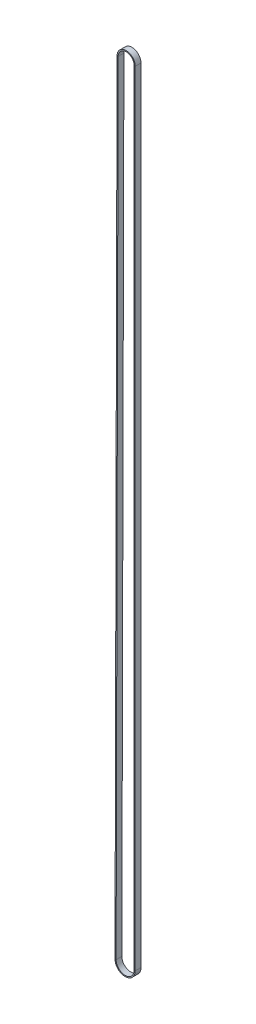
ISO-10303-21;
HEADER;
FILE_DESCRIPTION(('STEP AP214'),'2;1');
FILE_NAME('part.step','',(''),(''),'','','');
FILE_SCHEMA(('AUTOMOTIVE_DESIGN { 1 0 10303 214 1 1 1 1 }'));
ENDSEC;
DATA;
#1=APPLICATION_CONTEXT('core data for automotive mechanical design processes');
#2=APPLICATION_PROTOCOL_DEFINITION('international standard','automotive_design',2000,#1);
#3=PRODUCT_CONTEXT('',#1,'mechanical');
#4=PRODUCT('Part','Part','',(#3));
#5=PRODUCT_RELATED_PRODUCT_CATEGORY('part','',(#4));
#6=PRODUCT_DEFINITION_FORMATION('','',#4);
#7=PRODUCT_DEFINITION_CONTEXT('part definition',#1,'design');
#8=PRODUCT_DEFINITION('design','',#6,#7);
#9=PRODUCT_DEFINITION_SHAPE('','',#8);
#10=(LENGTH_UNIT() NAMED_UNIT(*) SI_UNIT(.MILLI.,.METRE.));
#11=(NAMED_UNIT(*) PLANE_ANGLE_UNIT() SI_UNIT($,.RADIAN.));
#12=(NAMED_UNIT(*) SI_UNIT($,.STERADIAN.) SOLID_ANGLE_UNIT());
#13=UNCERTAINTY_MEASURE_WITH_UNIT(LENGTH_MEASURE(1.E-05),#10,'distance_accuracy_value','');
#14=(GEOMETRIC_REPRESENTATION_CONTEXT(3) GLOBAL_UNCERTAINTY_ASSIGNED_CONTEXT((#13)) GLOBAL_UNIT_ASSIGNED_CONTEXT((#10,
#11,#12)) REPRESENTATION_CONTEXT('',''));
#15=CARTESIAN_POINT('',(0.,0.,0.));
#16=DIRECTION('',(0.,0.,1.));
#17=DIRECTION('',(1.,0.,0.));
#18=AXIS2_PLACEMENT_3D('',#15,#16,#17);
#19=CARTESIAN_POINT('',(59.9282558227644,-96.6526798806626,6.));
#20=DIRECTION('',(0.,0.,-1.));
#21=DIRECTION('',(-1.,0.,0.));
#22=AXIS2_PLACEMENT_3D('',#19,#20,#21);
#23=PLANE('',#22);
#24=CARTESIAN_POINT('',(59.9282558227644,-96.6526798806626,6.));
#25=DIRECTION('',(0.,0.,1.));
#26=DIRECTION('',(-1.,0.,0.));
#27=AXIS2_PLACEMENT_3D('',#24,#25,#26);
#28=CIRCLE('',#27,10.57);
#29=CARTESIAN_POINT('',(49.3582919942154,-96.6250273370828,6.));
#30=VERTEX_POINT('',#29);
#31=CARTESIAN_POINT('',(70.4982558227643,-96.6526798806626,6.));
#32=VERTEX_POINT('',#31);
#33=EDGE_CURVE('E160',#30,#32,#28,.T.);
#34=ORIENTED_EDGE('',*,*,#33,.T.);
#35=DIRECTION('',(0.,1.,0.));
#36=VECTOR('',#35,1.);
#37=CARTESIAN_POINT('',(70.4982558227643,-96.6526798806626,6.));
#38=LINE('',#37,#36);
#39=CARTESIAN_POINT('',(70.4982558227644,721.346620302412,6.));
#40=VERTEX_POINT('',#39);
#41=EDGE_CURVE('E164',#32,#40,#38,.T.);
#42=ORIENTED_EDGE('',*,*,#41,.T.);
#43=CARTESIAN_POINT('',(60.9982558227643,721.346620302412,6.));
#44=DIRECTION('',(0.,0.,1.));
#45=DIRECTION('',(1.,0.,0.));
#46=AXIS2_PLACEMENT_3D('',#43,#44,#45);
#47=CIRCLE('',#46,9.50000000000001);
#48=CARTESIAN_POINT('',(51.4982883325831,721.371473581883,6.));
#49=VERTEX_POINT('',#48);
#50=EDGE_CURVE('E167',#40,#49,#47,.T.);
#51=ORIENTED_EDGE('',*,*,#50,.T.);
#52=DIRECTION('',(-0.00261613468115293,-0.99999657791381,0.));
#53=VECTOR('',#52,1.);
#54=CARTESIAN_POINT('',(49.3582919942154,-96.6250273370828,6.));
#55=LINE('',#54,#53);
#56=EDGE_CURVE('E169',#49,#30,#55,.T.);
#57=ORIENTED_EDGE('',*,*,#56,.T.);
#58=EDGE_LOOP('',(#34,#42,#51,#57));
#59=FACE_BOUND('',#58,.T.);
#60=CARTESIAN_POINT('',(59.9282558227644,-96.6526798806626,6.));
#61=DIRECTION('',(0.,0.,1.));
#62=DIRECTION('',(-1.,0.,0.));
#63=AXIS2_PLACEMENT_3D('',#60,#61,#62);
#64=CIRCLE('',#63,9.42);
#65=CARTESIAN_POINT('',(50.5082880588163,-96.6280358919661,6.));
#66=VERTEX_POINT('',#65);
#67=CARTESIAN_POINT('',(69.3482558227644,-96.6526798806626,6.));
#68=VERTEX_POINT('',#67);
#69=EDGE_CURVE('E114',#66,#68,#64,.T.);
#70=ORIENTED_EDGE('',*,*,#69,.F.);
#71=DIRECTION('',(-0.00261613468115291,-0.99999657791381,0.));
#72=VECTOR('',#71,1.);
#73=CARTESIAN_POINT('',(50.5082880588163,-96.6280358919661,6.));
#74=LINE('',#73,#72);
#75=CARTESIAN_POINT('',(52.648284397184,721.368465027,6.));
#76=VERTEX_POINT('',#75);
#77=EDGE_CURVE('E141',#76,#66,#74,.T.);
#78=ORIENTED_EDGE('',*,*,#77,.F.);
#79=CARTESIAN_POINT('',(60.9982558227643,721.346620302412,6.));
#80=DIRECTION('',(0.,0.,1.));
#81=DIRECTION('',(1.,0.,0.));
#82=AXIS2_PLACEMENT_3D('',#79,#80,#81);
#83=CIRCLE('',#82,8.35000000000001);
#84=CARTESIAN_POINT('',(69.3482558227644,721.346620302412,6.));
#85=VERTEX_POINT('',#84);
#86=EDGE_CURVE('E136',#85,#76,#83,.T.);
#87=ORIENTED_EDGE('',*,*,#86,.F.);
#88=DIRECTION('',(0.,1.,0.));
#89=VECTOR('',#88,1.);
#90=CARTESIAN_POINT('',(69.3482558227644,-96.6526798806626,6.));
#91=LINE('',#90,#89);
#92=EDGE_CURVE('E123',#68,#85,#91,.T.);
#93=ORIENTED_EDGE('',*,*,#92,.F.);
#94=EDGE_LOOP('',(#70,#78,#87,#93));
#95=FACE_BOUND('',#94,.T.);
#96=ADVANCED_FACE('F40',(#59,#95),#23,.F.);
#97=CARTESIAN_POINT('',(59.9282558227644,-96.6526798806626,0.));
#98=DIRECTION('',(0.,0.,-1.));
#99=DIRECTION('',(-1.,0.,0.));
#100=AXIS2_PLACEMENT_3D('',#97,#98,#99);
#101=PLANE('',#100);
#102=CARTESIAN_POINT('',(59.9282558227644,-96.6526798806626,0.));
#103=DIRECTION('',(0.,0.,1.));
#104=DIRECTION('',(-1.,0.,0.));
#105=AXIS2_PLACEMENT_3D('',#102,#103,#104);
#106=CIRCLE('',#105,10.57);
#107=CARTESIAN_POINT('',(49.3582919942154,-96.6250273370828,0.));
#108=VERTEX_POINT('',#107);
#109=CARTESIAN_POINT('',(70.4982558227643,-96.6526798806626,0.));
#110=VERTEX_POINT('',#109);
#111=EDGE_CURVE('E132',#108,#110,#106,.T.);
#112=ORIENTED_EDGE('',*,*,#111,.F.);
#113=DIRECTION('',(-0.00261613468115293,-0.99999657791381,0.));
#114=VECTOR('',#113,1.);
#115=CARTESIAN_POINT('',(49.3582919942154,-96.6250273370828,0.));
#116=LINE('',#115,#114);
#117=CARTESIAN_POINT('',(51.4982883325831,721.371473581883,0.));
#118=VERTEX_POINT('',#117);
#119=EDGE_CURVE('E165',#118,#108,#116,.T.);
#120=ORIENTED_EDGE('',*,*,#119,.F.);
#121=CARTESIAN_POINT('',(60.9982558227643,721.346620302412,0.));
#122=DIRECTION('',(0.,0.,1.));
#123=DIRECTION('',(1.,0.,0.));
#124=AXIS2_PLACEMENT_3D('',#121,#122,#123);
#125=CIRCLE('',#124,9.50000000000001);
#126=CARTESIAN_POINT('',(70.4982558227644,721.346620302412,0.));
#127=VERTEX_POINT('',#126);
#128=EDGE_CURVE('E178',#127,#118,#125,.T.);
#129=ORIENTED_EDGE('',*,*,#128,.F.);
#130=DIRECTION('',(0.,1.,0.));
#131=VECTOR('',#130,1.);
#132=CARTESIAN_POINT('',(70.4982558227643,-96.6526798806626,0.));
#133=LINE('',#132,#131);
#134=EDGE_CURVE('E176',#110,#127,#133,.T.);
#135=ORIENTED_EDGE('',*,*,#134,.F.);
#136=EDGE_LOOP('',(#112,#120,#129,#135));
#137=FACE_BOUND('',#136,.T.);
#138=DIRECTION('',(-0.00261613468115291,-0.99999657791381,0.));
#139=VECTOR('',#138,1.);
#140=CARTESIAN_POINT('',(50.5082880588163,-96.6280358919661,0.));
#141=LINE('',#140,#139);
#142=CARTESIAN_POINT('',(52.648284397184,721.368465027,0.));
#143=VERTEX_POINT('',#142);
#144=CARTESIAN_POINT('',(50.5082880588163,-96.6280358919661,0.));
#145=VERTEX_POINT('',#144);
#146=EDGE_CURVE('E124',#143,#145,#141,.T.);
#147=ORIENTED_EDGE('',*,*,#146,.T.);
#148=CARTESIAN_POINT('',(59.9282558227644,-96.6526798806626,0.));
#149=DIRECTION('',(0.,0.,1.));
#150=DIRECTION('',(-1.,0.,0.));
#151=AXIS2_PLACEMENT_3D('',#148,#149,#150);
#152=CIRCLE('',#151,9.42);
#153=CARTESIAN_POINT('',(69.3482558227644,-96.6526798806626,0.));
#154=VERTEX_POINT('',#153);
#155=EDGE_CURVE('E66',#145,#154,#152,.T.);
#156=ORIENTED_EDGE('',*,*,#155,.T.);
#157=DIRECTION('',(0.,1.,0.));
#158=VECTOR('',#157,1.);
#159=CARTESIAN_POINT('',(69.3482558227644,-96.6526798806626,0.));
#160=LINE('',#159,#158);
#161=CARTESIAN_POINT('',(69.3482558227644,721.346620302412,0.));
#162=VERTEX_POINT('',#161);
#163=EDGE_CURVE('E130',#154,#162,#160,.T.);
#164=ORIENTED_EDGE('',*,*,#163,.T.);
#165=CARTESIAN_POINT('',(60.9982558227643,721.346620302412,0.));
#166=DIRECTION('',(0.,0.,1.));
#167=DIRECTION('',(1.,0.,0.));
#168=AXIS2_PLACEMENT_3D('',#165,#166,#167);
#169=CIRCLE('',#168,8.35000000000001);
#170=EDGE_CURVE('E150',#162,#143,#169,.T.);
#171=ORIENTED_EDGE('',*,*,#170,.T.);
#172=EDGE_LOOP('',(#147,#156,#164,#171));
#173=FACE_BOUND('',#172,.T.);
#174=ADVANCED_FACE('F198',(#137,#173),#101,.T.);
#175=CARTESIAN_POINT('',(59.9282558227644,-96.6526798806626,6.));
#176=DIRECTION('',(0.,0.,-1.));
#177=DIRECTION('',(-1.,0.,0.));
#178=AXIS2_PLACEMENT_3D('',#175,#176,#177);
#179=CYLINDRICAL_SURFACE('',#178,10.57);
#180=ORIENTED_EDGE('',*,*,#111,.T.);
#181=DIRECTION('',(0.,0.,-1.));
#182=VECTOR('',#181,1.);
#183=CARTESIAN_POINT('',(70.4982558227643,-96.6526798806626,6.));
#184=LINE('',#183,#182);
#185=EDGE_CURVE('E11',#32,#110,#184,.T.);
#186=ORIENTED_EDGE('',*,*,#185,.F.);
#187=ORIENTED_EDGE('',*,*,#33,.F.);
#188=DIRECTION('',(0.,0.,-1.));
#189=VECTOR('',#188,1.);
#190=CARTESIAN_POINT('',(49.3582919942154,-96.6250273370828,6.));
#191=LINE('',#190,#189);
#192=EDGE_CURVE('E172',#30,#108,#191,.T.);
#193=ORIENTED_EDGE('',*,*,#192,.T.);
#194=EDGE_LOOP('',(#180,#186,#187,#193));
#195=FACE_BOUND('',#194,.T.);
#196=ADVANCED_FACE('F42',(#195),#179,.T.);
#197=CARTESIAN_POINT('',(70.4982558227643,-96.6526798806626,6.));
#198=DIRECTION('',(-1.,0.,0.));
#199=DIRECTION('',(0.,-1.,0.));
#200=AXIS2_PLACEMENT_3D('',#197,#198,#199);
#201=PLANE('',#200);
#202=ORIENTED_EDGE('',*,*,#134,.T.);
#203=DIRECTION('',(0.,0.,-1.));
#204=VECTOR('',#203,1.);
#205=CARTESIAN_POINT('',(70.4982558227644,721.346620302412,6.));
#206=LINE('',#205,#204);
#207=EDGE_CURVE('E49',#40,#127,#206,.T.);
#208=ORIENTED_EDGE('',*,*,#207,.F.);
#209=ORIENTED_EDGE('',*,*,#41,.F.);
#210=ORIENTED_EDGE('',*,*,#185,.T.);
#211=EDGE_LOOP('',(#202,#208,#209,#210));
#212=FACE_BOUND('',#211,.T.);
#213=ADVANCED_FACE('F208',(#212),#201,.F.);
#214=CARTESIAN_POINT('',(60.9982558227643,721.346620302412,6.));
#215=DIRECTION('',(0.,0.,-1.));
#216=DIRECTION('',(-1.,0.,0.));
#217=AXIS2_PLACEMENT_3D('',#214,#215,#216);
#218=CYLINDRICAL_SURFACE('',#217,9.50000000000001);
#219=ORIENTED_EDGE('',*,*,#128,.T.);
#220=DIRECTION('',(0.,0.,-1.));
#221=VECTOR('',#220,1.);
#222=CARTESIAN_POINT('',(51.4982883325831,721.371473581883,6.));
#223=LINE('',#222,#221);
#224=EDGE_CURVE('E185',#49,#118,#223,.T.);
#225=ORIENTED_EDGE('',*,*,#224,.F.);
#226=ORIENTED_EDGE('',*,*,#50,.F.);
#227=ORIENTED_EDGE('',*,*,#207,.T.);
#228=EDGE_LOOP('',(#219,#225,#226,#227));
#229=FACE_BOUND('',#228,.T.);
#230=ADVANCED_FACE('F192',(#229),#218,.T.);
#231=CARTESIAN_POINT('',(49.3582919942154,-96.6250273370828,6.));
#232=DIRECTION('',(0.99999657791381,-0.00261613468115293,0.));
#233=DIRECTION('',(0.00261613468115293,0.99999657791381,0.));
#234=AXIS2_PLACEMENT_3D('',#231,#232,#233);
#235=PLANE('',#234);
#236=ORIENTED_EDGE('',*,*,#119,.T.);
#237=ORIENTED_EDGE('',*,*,#192,.F.);
#238=ORIENTED_EDGE('',*,*,#56,.F.);
#239=ORIENTED_EDGE('',*,*,#224,.T.);
#240=EDGE_LOOP('',(#236,#237,#238,#239));
#241=FACE_BOUND('',#240,.T.);
#242=ADVANCED_FACE('F202',(#241),#235,.F.);
#243=CARTESIAN_POINT('',(59.9282558227644,-96.6526798806626,6.));
#244=DIRECTION('',(0.,0.,-1.));
#245=DIRECTION('',(-1.,0.,0.));
#246=AXIS2_PLACEMENT_3D('',#243,#244,#245);
#247=CYLINDRICAL_SURFACE('',#246,9.42);
#248=ORIENTED_EDGE('',*,*,#155,.F.);
#249=DIRECTION('',(0.,0.,-1.));
#250=VECTOR('',#249,1.);
#251=CARTESIAN_POINT('',(50.5082880588163,-96.6280358919661,6.));
#252=LINE('',#251,#250);
#253=EDGE_CURVE('E118',#66,#145,#252,.T.);
#254=ORIENTED_EDGE('',*,*,#253,.F.);
#255=ORIENTED_EDGE('',*,*,#69,.T.);
#256=DIRECTION('',(0.,0.,-1.));
#257=VECTOR('',#256,1.);
#258=CARTESIAN_POINT('',(69.3482558227644,-96.6526798806626,6.));
#259=LINE('',#258,#257);
#260=EDGE_CURVE('E117',#68,#154,#259,.T.);
#261=ORIENTED_EDGE('',*,*,#260,.T.);
#262=EDGE_LOOP('',(#248,#254,#255,#261));
#263=FACE_BOUND('',#262,.T.);
#264=ADVANCED_FACE('F116',(#263),#247,.F.);
#265=CARTESIAN_POINT('',(69.3482558227644,-96.6526798806626,6.));
#266=DIRECTION('',(-1.,0.,0.));
#267=DIRECTION('',(0.,0.,1.));
#268=AXIS2_PLACEMENT_3D('',#265,#266,#267);
#269=PLANE('',#268);
#270=ORIENTED_EDGE('',*,*,#163,.F.);
#271=ORIENTED_EDGE('',*,*,#260,.F.);
#272=ORIENTED_EDGE('',*,*,#92,.T.);
#273=DIRECTION('',(0.,0.,-1.));
#274=VECTOR('',#273,1.);
#275=CARTESIAN_POINT('',(69.3482558227644,721.346620302412,6.));
#276=LINE('',#275,#274);
#277=EDGE_CURVE('E133',#85,#162,#276,.T.);
#278=ORIENTED_EDGE('',*,*,#277,.T.);
#279=EDGE_LOOP('',(#270,#271,#272,#278));
#280=FACE_BOUND('',#279,.T.);
#281=ADVANCED_FACE('F127',(#280),#269,.T.);
#282=CARTESIAN_POINT('',(60.9982558227643,721.346620302412,6.));
#283=DIRECTION('',(0.,0.,-1.));
#284=DIRECTION('',(-1.,0.,0.));
#285=AXIS2_PLACEMENT_3D('',#282,#283,#284);
#286=CYLINDRICAL_SURFACE('',#285,8.35000000000001);
#287=ORIENTED_EDGE('',*,*,#170,.F.);
#288=ORIENTED_EDGE('',*,*,#277,.F.);
#289=ORIENTED_EDGE('',*,*,#86,.T.);
#290=DIRECTION('',(0.,0.,-1.));
#291=VECTOR('',#290,1.);
#292=CARTESIAN_POINT('',(52.648284397184,721.368465027,6.));
#293=LINE('',#292,#291);
#294=EDGE_CURVE('E56',#76,#143,#293,.T.);
#295=ORIENTED_EDGE('',*,*,#294,.T.);
#296=EDGE_LOOP('',(#287,#288,#289,#295));
#297=FACE_BOUND('',#296,.T.);
#298=ADVANCED_FACE('F231',(#297),#286,.F.);
#299=CARTESIAN_POINT('',(50.5082880588163,-96.6280358919661,6.));
#300=DIRECTION('',(0.99999657791381,-0.00261613468115292,0.));
#301=DIRECTION('',(0.00261613468115292,0.99999657791381,0.));
#302=AXIS2_PLACEMENT_3D('',#299,#300,#301);
#303=PLANE('',#302);
#304=ORIENTED_EDGE('',*,*,#146,.F.);
#305=ORIENTED_EDGE('',*,*,#294,.F.);
#306=ORIENTED_EDGE('',*,*,#77,.T.);
#307=ORIENTED_EDGE('',*,*,#253,.T.);
#308=EDGE_LOOP('',(#304,#305,#306,#307));
#309=FACE_BOUND('',#308,.T.);
#310=ADVANCED_FACE('F235',(#309),#303,.T.);
#311=CLOSED_SHELL('',(#96,#174,#196,#213,#230,#242,#264,#281,#298,#310));
#312=MANIFOLD_SOLID_BREP('B2',#311);
#313=ADVANCED_BREP_SHAPE_REPRESENTATION('',(#18,#312),#14);
#314=SHAPE_DEFINITION_REPRESENTATION(#9,#313);
ENDSEC;
END-ISO-10303-21;
